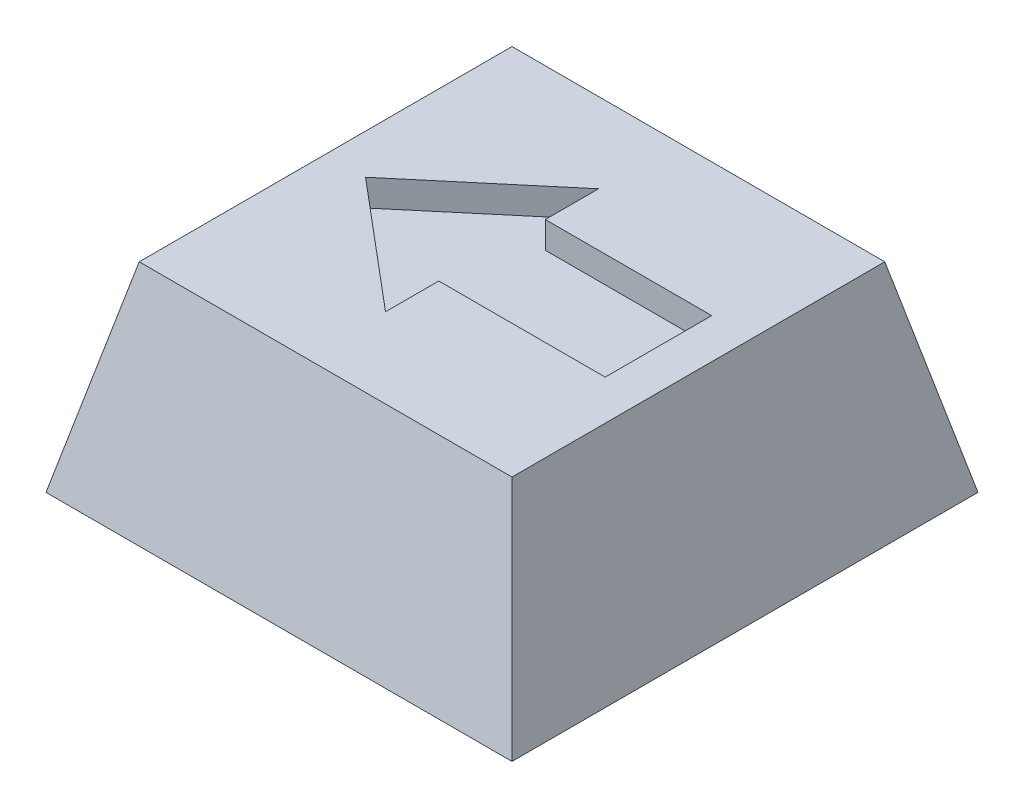
ISO-10303-21;
HEADER;
FILE_DESCRIPTION(('STEP AP214'),'2;1');
FILE_NAME('part.step','',(''),(''),'','','');
FILE_SCHEMA(('AUTOMOTIVE_DESIGN { 1 0 10303 214 1 1 1 1 }'));
ENDSEC;
DATA;
#1=APPLICATION_CONTEXT('core data for automotive mechanical design processes');
#2=APPLICATION_PROTOCOL_DEFINITION('international standard','automotive_design',2000,#1);
#3=PRODUCT_CONTEXT('',#1,'mechanical');
#4=PRODUCT('Part','Part','',(#3));
#5=PRODUCT_RELATED_PRODUCT_CATEGORY('part','',(#4));
#6=PRODUCT_DEFINITION_FORMATION('','',#4);
#7=PRODUCT_DEFINITION_CONTEXT('part definition',#1,'design');
#8=PRODUCT_DEFINITION('design','',#6,#7);
#9=PRODUCT_DEFINITION_SHAPE('','',#8);
#10=(LENGTH_UNIT() NAMED_UNIT(*) SI_UNIT(.MILLI.,.METRE.));
#11=(NAMED_UNIT(*) PLANE_ANGLE_UNIT() SI_UNIT($,.RADIAN.));
#12=(NAMED_UNIT(*) SI_UNIT($,.STERADIAN.) SOLID_ANGLE_UNIT());
#13=UNCERTAINTY_MEASURE_WITH_UNIT(LENGTH_MEASURE(1.E-05),#10,'distance_accuracy_value','');
#14=(GEOMETRIC_REPRESENTATION_CONTEXT(3) GLOBAL_UNCERTAINTY_ASSIGNED_CONTEXT((#13)) GLOBAL_UNIT_ASSIGNED_CONTEXT((#10,
#11,#12)) REPRESENTATION_CONTEXT('',''));
#15=CARTESIAN_POINT('',(0.,0.,0.));
#16=DIRECTION('',(0.,0.,1.));
#17=DIRECTION('',(1.,0.,0.));
#18=AXIS2_PLACEMENT_3D('',#15,#16,#17);
#19=CARTESIAN_POINT('',(0.,3.,0.));
#20=DIRECTION('',(0.,-1.,0.));
#21=DIRECTION('',(0.,0.,-1.));
#22=AXIS2_PLACEMENT_3D('',#19,#20,#21);
#23=PLANE('',#22);
#24=DIRECTION('',(0.,0.,-1.));
#25=VECTOR('',#24,1.);
#26=CARTESIAN_POINT('',(3.2,3.,0.));
#27=LINE('',#26,#25);
#28=CARTESIAN_POINT('',(3.2,3.,-4.3));
#29=VERTEX_POINT('',#28);
#30=CARTESIAN_POINT('',(3.2,3.,-5.1));
#31=VERTEX_POINT('',#30);
#32=EDGE_CURVE('E169',#29,#31,#27,.T.);
#33=ORIENTED_EDGE('',*,*,#32,.F.);
#34=DIRECTION('',(-1.,0.,0.));
#35=VECTOR('',#34,1.);
#36=CARTESIAN_POINT('',(0.,3.,-4.3));
#37=LINE('',#36,#35);
#38=CARTESIAN_POINT('',(5.7,3.,-4.3));
#39=VERTEX_POINT('',#38);
#40=EDGE_CURVE('E58',#39,#29,#37,.T.);
#41=ORIENTED_EDGE('',*,*,#40,.F.);
#42=DIRECTION('',(0.,0.,1.));
#43=VECTOR('',#42,1.);
#44=CARTESIAN_POINT('',(5.7,3.,0.));
#45=LINE('',#44,#43);
#46=CARTESIAN_POINT('',(5.7,3.,-2.7));
#47=VERTEX_POINT('',#46);
#48=EDGE_CURVE('E149',#39,#47,#45,.T.);
#49=ORIENTED_EDGE('',*,*,#48,.T.);
#50=DIRECTION('',(-1.,0.,0.));
#51=VECTOR('',#50,1.);
#52=CARTESIAN_POINT('',(0.,3.,-2.7));
#53=LINE('',#52,#51);
#54=CARTESIAN_POINT('',(3.2,3.,-2.7));
#55=VERTEX_POINT('',#54);
#56=EDGE_CURVE('E153',#47,#55,#53,.T.);
#57=ORIENTED_EDGE('',*,*,#56,.T.);
#58=CARTESIAN_POINT('',(3.2,3.,-1.9));
#59=VERTEX_POINT('',#58);
#60=EDGE_CURVE('E173',#59,#55,#27,.T.);
#61=ORIENTED_EDGE('',*,*,#60,.F.);
#62=DIRECTION('',(0.764911198117051,0.,0.644135745782779));
#63=VECTOR('',#62,1.);
#64=CARTESIAN_POINT('',(2.26385737439222,3.,-2.68833063209076));
#65=LINE('',#64,#63);
#66=CARTESIAN_POINT('',(1.3,3.,-3.5));
#67=VERTEX_POINT('',#66);
#68=EDGE_CURVE('E177',#67,#59,#65,.T.);
#69=ORIENTED_EDGE('',*,*,#68,.F.);
#70=DIRECTION('',(-0.764911198117051,0.,0.64413574578278));
#71=VECTOR('',#70,1.);
#72=CARTESIAN_POINT('',(-1.18508914100486,3.,-1.40729335494328));
#73=LINE('',#72,#71);
#74=EDGE_CURVE('E172',#31,#67,#73,.T.);
#75=ORIENTED_EDGE('',*,*,#74,.F.);
#76=EDGE_LOOP('',(#33,#41,#49,#57,#61,#69,#75));
#77=FACE_BOUND('',#76,.T.);
#78=DIRECTION('',(-1.,0.,0.));
#79=VECTOR('',#78,1.);
#80=CARTESIAN_POINT('',(11.,3.,-0.7));
#81=LINE('',#80,#79);
#82=CARTESIAN_POINT('',(6.3,3.,-0.7));
#83=VERTEX_POINT('',#82);
#84=CARTESIAN_POINT('',(0.7,3.,-0.7));
#85=VERTEX_POINT('',#84);
#86=EDGE_CURVE('E65',#83,#85,#81,.T.);
#87=ORIENTED_EDGE('',*,*,#86,.F.);
#88=DIRECTION('',(0.,0.,1.));
#89=VECTOR('',#88,1.);
#90=CARTESIAN_POINT('',(6.3,3.,-7.));
#91=LINE('',#90,#89);
#92=CARTESIAN_POINT('',(6.3,3.,-6.3));
#93=VERTEX_POINT('',#92);
#94=EDGE_CURVE('E221',#93,#83,#91,.T.);
#95=ORIENTED_EDGE('',*,*,#94,.F.);
#96=DIRECTION('',(-1.,0.,0.));
#97=VECTOR('',#96,1.);
#98=CARTESIAN_POINT('',(11.,3.,-6.3));
#99=LINE('',#98,#97);
#100=CARTESIAN_POINT('',(0.699999999999998,3.,-6.3));
#101=VERTEX_POINT('',#100);
#102=EDGE_CURVE('E206',#93,#101,#99,.T.);
#103=ORIENTED_EDGE('',*,*,#102,.T.);
#104=DIRECTION('',(0.,0.,1.));
#105=VECTOR('',#104,1.);
#106=CARTESIAN_POINT('',(0.7,3.,-7.));
#107=LINE('',#106,#105);
#108=EDGE_CURVE('E222',#101,#85,#107,.T.);
#109=ORIENTED_EDGE('',*,*,#108,.T.);
#110=EDGE_LOOP('',(#87,#95,#103,#109));
#111=FACE_BOUND('',#110,.T.);
#112=ADVANCED_FACE('F42',(#77,#111),#23,.F.);
#113=CARTESIAN_POINT('',(7.,0.,-7.));
#114=DIRECTION('',(-0.973841209741793,-0.227229615606418,0.));
#115=DIRECTION('',(0.227229615606418,-0.973841209741793,0.));
#116=AXIS2_PLACEMENT_3D('',#113,#114,#115);
#117=PLANE('',#116);
#118=DIRECTION('',(-0.221581128241521,0.949633406749377,-0.221581128241521));
#119=VECTOR('',#118,1.);
#120=CARTESIAN_POINT('',(6.6563126252505,1.47294589178357,-0.343687374749499));
#121=LINE('',#120,#119);
#122=CARTESIAN_POINT('',(7.,0.,0.));
#123=VERTEX_POINT('',#122);
#124=EDGE_CURVE('E218',#123,#83,#121,.T.);
#125=ORIENTED_EDGE('',*,*,#124,.F.);
#126=DIRECTION('',(0.,0.,-1.));
#127=VECTOR('',#126,1.);
#128=CARTESIAN_POINT('',(7.,0.,0.));
#129=LINE('',#128,#127);
#130=CARTESIAN_POINT('',(7.,0.,-7.));
#131=VERTEX_POINT('',#130);
#132=EDGE_CURVE('E236',#123,#131,#129,.T.);
#133=ORIENTED_EDGE('',*,*,#132,.T.);
#134=DIRECTION('',(0.221581128241521,-0.949633406749377,-0.221581128241521));
#135=VECTOR('',#134,1.);
#136=CARTESIAN_POINT('',(7.,0.,-7.));
#137=LINE('',#136,#135);
#138=EDGE_CURVE('E212',#93,#131,#137,.T.);
#139=ORIENTED_EDGE('',*,*,#138,.F.);
#140=ORIENTED_EDGE('',*,*,#94,.T.);
#141=EDGE_LOOP('',(#125,#133,#139,#140));
#142=FACE_BOUND('',#141,.T.);
#143=ADVANCED_FACE('F260',(#142),#117,.F.);
#144=CARTESIAN_POINT('',(0.,0.,-7.));
#145=DIRECTION('',(0.973841209741793,-0.227229615606418,0.));
#146=DIRECTION('',(0.227229615606418,0.973841209741793,0.));
#147=AXIS2_PLACEMENT_3D('',#144,#145,#146);
#148=PLANE('',#147);
#149=DIRECTION('',(-0.221581128241521,-0.949633406749378,0.221581128241521));
#150=VECTOR('',#149,1.);
#151=CARTESIAN_POINT('',(0.343687374749499,1.47294589178357,-0.3436873747495));
#152=LINE('',#151,#150);
#153=CARTESIAN_POINT('',(0.,0.,0.));
#154=VERTEX_POINT('',#153);
#155=EDGE_CURVE('E11',#85,#154,#152,.T.);
#156=ORIENTED_EDGE('',*,*,#155,.F.);
#157=ORIENTED_EDGE('',*,*,#108,.F.);
#158=DIRECTION('',(0.221581128241521,0.949633406749377,0.221581128241521));
#159=VECTOR('',#158,1.);
#160=CARTESIAN_POINT('',(0.,0.,-7.));
#161=LINE('',#160,#159);
#162=CARTESIAN_POINT('',(0.,0.,-7.));
#163=VERTEX_POINT('',#162);
#164=EDGE_CURVE('E51',#163,#101,#161,.T.);
#165=ORIENTED_EDGE('',*,*,#164,.F.);
#166=DIRECTION('',(0.,0.,1.));
#167=VECTOR('',#166,1.);
#168=CARTESIAN_POINT('',(0.,0.,0.));
#169=LINE('',#168,#167);
#170=EDGE_CURVE('E226',#163,#154,#169,.T.);
#171=ORIENTED_EDGE('',*,*,#170,.T.);
#172=EDGE_LOOP('',(#156,#157,#165,#171));
#173=FACE_BOUND('',#172,.T.);
#174=ADVANCED_FACE('F253',(#173),#148,.F.);
#175=CARTESIAN_POINT('',(0.,0.,0.));
#176=DIRECTION('',(0.,-1.,0.));
#177=DIRECTION('',(0.,0.,-1.));
#178=AXIS2_PLACEMENT_3D('',#175,#176,#177);
#179=PLANE('',#178);
#180=CARTESIAN_POINT('',(3.5,0.,-3.5));
#181=DIRECTION('',(0.,-1.,0.));
#182=DIRECTION('',(0.,0.,-1.));
#183=AXIS2_PLACEMENT_3D('',#180,#181,#182);
#184=CIRCLE('',#183,1.8);
#185=CARTESIAN_POINT('',(3.5,0.,-5.3));
#186=VERTEX_POINT('',#185);
#187=EDGE_CURVE('E187',#186,#186,#184,.T.);
#188=ORIENTED_EDGE('',*,*,#187,.F.);
#189=EDGE_LOOP('',(#188));
#190=FACE_BOUND('',#189,.T.);
#191=ORIENTED_EDGE('',*,*,#170,.F.);
#192=DIRECTION('',(-1.,0.,0.));
#193=VECTOR('',#192,1.);
#194=CARTESIAN_POINT('',(0.,0.,-7.));
#195=LINE('',#194,#193);
#196=EDGE_CURVE('E240',#131,#163,#195,.T.);
#197=ORIENTED_EDGE('',*,*,#196,.F.);
#198=ORIENTED_EDGE('',*,*,#132,.F.);
#199=DIRECTION('',(1.,0.,0.));
#200=VECTOR('',#199,1.);
#201=CARTESIAN_POINT('',(0.,0.,0.));
#202=LINE('',#201,#200);
#203=EDGE_CURVE('E233',#154,#123,#202,.T.);
#204=ORIENTED_EDGE('',*,*,#203,.F.);
#205=EDGE_LOOP('',(#191,#197,#198,#204));
#206=FACE_BOUND('',#205,.T.);
#207=ADVANCED_FACE('F44',(#190,#206),#179,.T.);
#208=CARTESIAN_POINT('',(11.,3.,-6.3));
#209=DIRECTION('',(0.,0.227229615606418,-0.973841209741793));
#210=DIRECTION('',(0.,0.973841209741793,0.227229615606418));
#211=AXIS2_PLACEMENT_3D('',#208,#209,#210);
#212=PLANE('',#211);
#213=ORIENTED_EDGE('',*,*,#138,.T.);
#214=ORIENTED_EDGE('',*,*,#196,.T.);
#215=ORIENTED_EDGE('',*,*,#164,.T.);
#216=ORIENTED_EDGE('',*,*,#102,.F.);
#217=EDGE_LOOP('',(#213,#214,#215,#216));
#218=FACE_BOUND('',#217,.T.);
#219=ADVANCED_FACE('F245',(#218),#212,.T.);
#220=CARTESIAN_POINT('',(11.,0.,0.));
#221=DIRECTION('',(0.,0.227229615606418,0.973841209741793));
#222=DIRECTION('',(0.,-0.973841209741793,0.227229615606418));
#223=AXIS2_PLACEMENT_3D('',#220,#221,#222);
#224=PLANE('',#223);
#225=ORIENTED_EDGE('',*,*,#124,.T.);
#226=ORIENTED_EDGE('',*,*,#86,.T.);
#227=ORIENTED_EDGE('',*,*,#155,.T.);
#228=ORIENTED_EDGE('',*,*,#203,.T.);
#229=EDGE_LOOP('',(#225,#226,#227,#228));
#230=FACE_BOUND('',#229,.T.);
#231=ADVANCED_FACE('F255',(#230),#224,.T.);
#232=CARTESIAN_POINT('',(3.5,0.8,-3.5));
#233=DIRECTION('',(0.,-1.,0.));
#234=DIRECTION('',(0.,0.,-1.));
#235=AXIS2_PLACEMENT_3D('',#232,#233,#234);
#236=CYLINDRICAL_SURFACE('',#235,1.8);
#237=CARTESIAN_POINT('',(3.5,0.8,-3.5));
#238=DIRECTION('',(0.,-1.,0.));
#239=DIRECTION('',(0.,0.,-1.));
#240=AXIS2_PLACEMENT_3D('',#237,#238,#239);
#241=CIRCLE('',#240,1.8);
#242=CARTESIAN_POINT('',(3.5,0.8,-5.3));
#243=VERTEX_POINT('',#242);
#244=EDGE_CURVE('E202',#243,#243,#241,.T.);
#245=ORIENTED_EDGE('',*,*,#244,.F.);
#246=EDGE_LOOP('',(#245));
#247=FACE_BOUND('',#246,.T.);
#248=ORIENTED_EDGE('',*,*,#187,.T.);
#249=EDGE_LOOP('',(#248));
#250=FACE_BOUND('',#249,.T.);
#251=ADVANCED_FACE('F281',(#247,#250),#236,.F.);
#252=CARTESIAN_POINT('',(3.5,0.8,-3.5));
#253=DIRECTION('',(0.,-1.,0.));
#254=DIRECTION('',(0.,0.,-1.));
#255=AXIS2_PLACEMENT_3D('',#252,#253,#254);
#256=PLANE('',#255);
#257=ORIENTED_EDGE('',*,*,#244,.T.);
#258=EDGE_LOOP('',(#257));
#259=FACE_BOUND('',#258,.T.);
#260=ADVANCED_FACE('F284',(#259),#256,.T.);
#261=CARTESIAN_POINT('',(0.,2.6,-4.3));
#262=DIRECTION('',(0.,0.,-1.));
#263=DIRECTION('',(-1.,0.,0.));
#264=AXIS2_PLACEMENT_3D('',#261,#262,#263);
#265=PLANE('',#264);
#266=ORIENTED_EDGE('',*,*,#40,.T.);
#267=DIRECTION('',(0.,1.,0.));
#268=VECTOR('',#267,1.);
#269=CARTESIAN_POINT('',(3.2,2.6,-4.3));
#270=LINE('',#269,#268);
#271=CARTESIAN_POINT('',(3.2,2.6,-4.3));
#272=VERTEX_POINT('',#271);
#273=EDGE_CURVE('E123',#272,#29,#270,.T.);
#274=ORIENTED_EDGE('',*,*,#273,.F.);
#275=DIRECTION('',(-1.,0.,0.));
#276=VECTOR('',#275,1.);
#277=CARTESIAN_POINT('',(0.,2.6,-4.3));
#278=LINE('',#277,#276);
#279=CARTESIAN_POINT('',(5.7,2.6,-4.3));
#280=VERTEX_POINT('',#279);
#281=EDGE_CURVE('E127',#280,#272,#278,.T.);
#282=ORIENTED_EDGE('',*,*,#281,.F.);
#283=DIRECTION('',(0.,1.,0.));
#284=VECTOR('',#283,1.);
#285=CARTESIAN_POINT('',(5.7,2.6,-4.3));
#286=LINE('',#285,#284);
#287=EDGE_CURVE('E184',#280,#39,#286,.T.);
#288=ORIENTED_EDGE('',*,*,#287,.T.);
#289=EDGE_LOOP('',(#266,#274,#282,#288));
#290=FACE_BOUND('',#289,.T.);
#291=ADVANCED_FACE('F125',(#290),#265,.F.);
#292=CARTESIAN_POINT('',(5.7,2.6,0.));
#293=DIRECTION('',(-1.,0.,0.));
#294=DIRECTION('',(0.,0.,1.));
#295=AXIS2_PLACEMENT_3D('',#292,#293,#294);
#296=PLANE('',#295);
#297=ORIENTED_EDGE('',*,*,#48,.F.);
#298=ORIENTED_EDGE('',*,*,#287,.F.);
#299=DIRECTION('',(0.,0.,1.));
#300=VECTOR('',#299,1.);
#301=CARTESIAN_POINT('',(5.7,2.6,0.));
#302=LINE('',#301,#300);
#303=CARTESIAN_POINT('',(5.7,2.6,-2.7));
#304=VERTEX_POINT('',#303);
#305=EDGE_CURVE('E133',#280,#304,#302,.T.);
#306=ORIENTED_EDGE('',*,*,#305,.T.);
#307=DIRECTION('',(0.,1.,0.));
#308=VECTOR('',#307,1.);
#309=CARTESIAN_POINT('',(5.7,2.6,-2.7));
#310=LINE('',#309,#308);
#311=EDGE_CURVE('E188',#304,#47,#310,.T.);
#312=ORIENTED_EDGE('',*,*,#311,.T.);
#313=EDGE_LOOP('',(#297,#298,#306,#312));
#314=FACE_BOUND('',#313,.T.);
#315=ADVANCED_FACE('F291',(#314),#296,.T.);
#316=CARTESIAN_POINT('',(0.,2.6,-2.7));
#317=DIRECTION('',(0.,0.,-1.));
#318=DIRECTION('',(-1.,0.,0.));
#319=AXIS2_PLACEMENT_3D('',#316,#317,#318);
#320=PLANE('',#319);
#321=ORIENTED_EDGE('',*,*,#56,.F.);
#322=ORIENTED_EDGE('',*,*,#311,.F.);
#323=DIRECTION('',(-1.,0.,0.));
#324=VECTOR('',#323,1.);
#325=CARTESIAN_POINT('',(0.,2.6,-2.7));
#326=LINE('',#325,#324);
#327=CARTESIAN_POINT('',(3.2,2.6,-2.7));
#328=VERTEX_POINT('',#327);
#329=EDGE_CURVE('E162',#304,#328,#326,.T.);
#330=ORIENTED_EDGE('',*,*,#329,.T.);
#331=DIRECTION('',(0.,1.,0.));
#332=VECTOR('',#331,1.);
#333=CARTESIAN_POINT('',(3.2,2.6,-2.7));
#334=LINE('',#333,#332);
#335=EDGE_CURVE('E191',#328,#55,#334,.T.);
#336=ORIENTED_EDGE('',*,*,#335,.T.);
#337=EDGE_LOOP('',(#321,#322,#330,#336));
#338=FACE_BOUND('',#337,.T.);
#339=ADVANCED_FACE('F303',(#338),#320,.T.);
#340=CARTESIAN_POINT('',(3.2,2.6,0.));
#341=DIRECTION('',(1.,0.,0.));
#342=DIRECTION('',(0.,0.,-1.));
#343=AXIS2_PLACEMENT_3D('',#340,#341,#342);
#344=PLANE('',#343);
#345=ORIENTED_EDGE('',*,*,#60,.T.);
#346=ORIENTED_EDGE('',*,*,#335,.F.);
#347=DIRECTION('',(0.,0.,-1.));
#348=VECTOR('',#347,1.);
#349=CARTESIAN_POINT('',(3.2,2.6,0.));
#350=LINE('',#349,#348);
#351=CARTESIAN_POINT('',(3.2,2.6,-1.9));
#352=VERTEX_POINT('',#351);
#353=EDGE_CURVE('E144',#352,#328,#350,.T.);
#354=ORIENTED_EDGE('',*,*,#353,.F.);
#355=DIRECTION('',(0.,1.,0.));
#356=VECTOR('',#355,1.);
#357=CARTESIAN_POINT('',(3.2,2.6,-1.9));
#358=LINE('',#357,#356);
#359=EDGE_CURVE('E194',#352,#59,#358,.T.);
#360=ORIENTED_EDGE('',*,*,#359,.T.);
#361=EDGE_LOOP('',(#345,#346,#354,#360));
#362=FACE_BOUND('',#361,.T.);
#363=ADVANCED_FACE('F299',(#362),#344,.F.);
#364=CARTESIAN_POINT('',(2.26385737439222,2.6,-2.68833063209076));
#365=DIRECTION('',(-0.644135745782779,0.,0.764911198117052));
#366=DIRECTION('',(0.764911198117052,0.,0.644135745782779));
#367=AXIS2_PLACEMENT_3D('',#364,#365,#366);
#368=PLANE('',#367);
#369=ORIENTED_EDGE('',*,*,#68,.T.);
#370=ORIENTED_EDGE('',*,*,#359,.F.);
#371=DIRECTION('',(0.764911198117051,0.,0.644135745782779));
#372=VECTOR('',#371,1.);
#373=CARTESIAN_POINT('',(2.26385737439222,2.6,-2.68833063209076));
#374=LINE('',#373,#372);
#375=CARTESIAN_POINT('',(1.3,2.6,-3.5));
#376=VERTEX_POINT('',#375);
#377=EDGE_CURVE('E158',#376,#352,#374,.T.);
#378=ORIENTED_EDGE('',*,*,#377,.F.);
#379=DIRECTION('',(0.,1.,0.));
#380=VECTOR('',#379,1.);
#381=CARTESIAN_POINT('',(1.3,2.6,-3.5));
#382=LINE('',#381,#380);
#383=EDGE_CURVE('E197',#376,#67,#382,.T.);
#384=ORIENTED_EDGE('',*,*,#383,.T.);
#385=EDGE_LOOP('',(#369,#370,#378,#384));
#386=FACE_BOUND('',#385,.T.);
#387=ADVANCED_FACE('F295',(#386),#368,.F.);
#388=CARTESIAN_POINT('',(-1.18508914100486,2.6,-1.40729335494328));
#389=DIRECTION('',(-0.64413574578278,0.,-0.764911198117051));
#390=DIRECTION('',(-0.764911198117051,0.,0.64413574578278));
#391=AXIS2_PLACEMENT_3D('',#388,#389,#390);
#392=PLANE('',#391);
#393=ORIENTED_EDGE('',*,*,#74,.T.);
#394=ORIENTED_EDGE('',*,*,#383,.F.);
#395=DIRECTION('',(-0.764911198117051,0.,0.64413574578278));
#396=VECTOR('',#395,1.);
#397=CARTESIAN_POINT('',(-1.18508914100486,2.6,-1.40729335494328));
#398=LINE('',#397,#396);
#399=CARTESIAN_POINT('',(3.2,2.6,-5.1));
#400=VERTEX_POINT('',#399);
#401=EDGE_CURVE('E142',#400,#376,#398,.T.);
#402=ORIENTED_EDGE('',*,*,#401,.F.);
#403=DIRECTION('',(0.,1.,0.));
#404=VECTOR('',#403,1.);
#405=CARTESIAN_POINT('',(3.2,2.6,-5.1));
#406=LINE('',#405,#404);
#407=EDGE_CURVE('E132',#400,#31,#406,.T.);
#408=ORIENTED_EDGE('',*,*,#407,.T.);
#409=EDGE_LOOP('',(#393,#394,#402,#408));
#410=FACE_BOUND('',#409,.T.);
#411=ADVANCED_FACE('F292',(#410),#392,.F.);
#412=ORIENTED_EDGE('',*,*,#32,.T.);
#413=ORIENTED_EDGE('',*,*,#407,.F.);
#414=EDGE_CURVE('E136',#272,#400,#350,.T.);
#415=ORIENTED_EDGE('',*,*,#414,.F.);
#416=ORIENTED_EDGE('',*,*,#273,.T.);
#417=EDGE_LOOP('',(#412,#413,#415,#416));
#418=FACE_BOUND('',#417,.T.);
#419=ADVANCED_FACE('F137',(#418),#344,.F.);
#420=CARTESIAN_POINT('',(0.,2.6,0.));
#421=DIRECTION('',(0.,1.,0.));
#422=DIRECTION('',(0.,0.,1.));
#423=AXIS2_PLACEMENT_3D('',#420,#421,#422);
#424=PLANE('',#423);
#425=ORIENTED_EDGE('',*,*,#281,.T.);
#426=ORIENTED_EDGE('',*,*,#414,.T.);
#427=ORIENTED_EDGE('',*,*,#401,.T.);
#428=ORIENTED_EDGE('',*,*,#377,.T.);
#429=ORIENTED_EDGE('',*,*,#353,.T.);
#430=ORIENTED_EDGE('',*,*,#329,.F.);
#431=ORIENTED_EDGE('',*,*,#305,.F.);
#432=EDGE_LOOP('',(#425,#426,#427,#428,#429,#430,#431));
#433=FACE_BOUND('',#432,.T.);
#434=ADVANCED_FACE('F146',(#433),#424,.T.);
#435=CLOSED_SHELL('',(#112,#143,#174,#207,#219,#231,#251,#260,#291,#315,#339,#363,#387,#411,
#419,#434));
#436=MANIFOLD_SOLID_BREP('B2',#435);
#437=ADVANCED_BREP_SHAPE_REPRESENTATION('',(#18,#436),#14);
#438=SHAPE_DEFINITION_REPRESENTATION(#9,#437);
ENDSEC;
END-ISO-10303-21;
